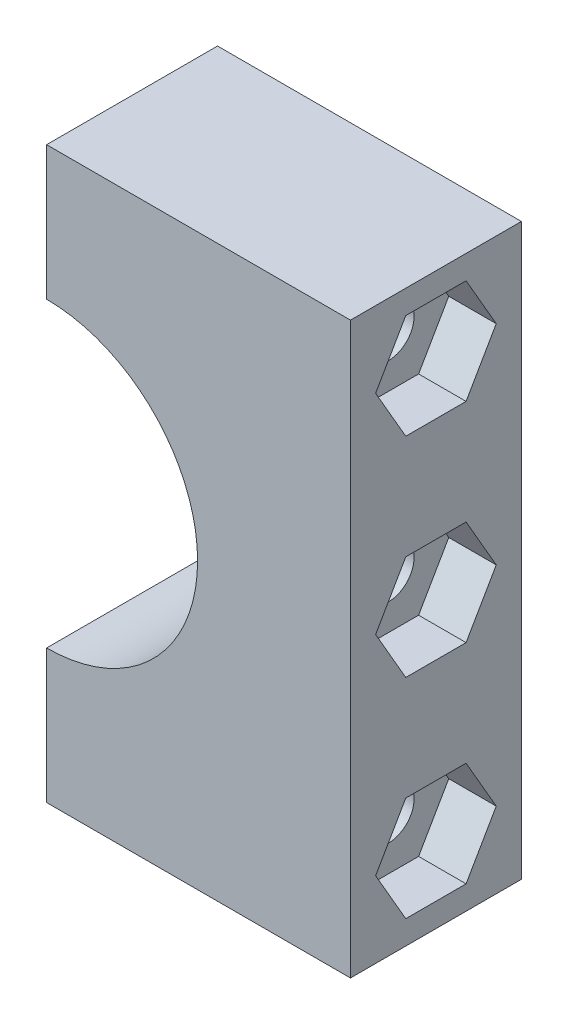
ISO-10303-21;
HEADER;
FILE_DESCRIPTION(('STEP AP214'),'2;1');
FILE_NAME('part.step','',(''),(''),'','','');
FILE_SCHEMA(('AUTOMOTIVE_DESIGN { 1 0 10303 214 1 1 1 1 }'));
ENDSEC;
DATA;
#1=APPLICATION_CONTEXT('core data for automotive mechanical design processes');
#2=APPLICATION_PROTOCOL_DEFINITION('international standard','automotive_design',2000,#1);
#3=PRODUCT_CONTEXT('',#1,'mechanical');
#4=PRODUCT('Part','Part','',(#3));
#5=PRODUCT_RELATED_PRODUCT_CATEGORY('part','',(#4));
#6=PRODUCT_DEFINITION_FORMATION('','',#4);
#7=PRODUCT_DEFINITION_CONTEXT('part definition',#1,'design');
#8=PRODUCT_DEFINITION('design','',#6,#7);
#9=PRODUCT_DEFINITION_SHAPE('','',#8);
#10=(LENGTH_UNIT() NAMED_UNIT(*) SI_UNIT(.MILLI.,.METRE.));
#11=(NAMED_UNIT(*) PLANE_ANGLE_UNIT() SI_UNIT($,.RADIAN.));
#12=(NAMED_UNIT(*) SI_UNIT($,.STERADIAN.) SOLID_ANGLE_UNIT());
#13=UNCERTAINTY_MEASURE_WITH_UNIT(LENGTH_MEASURE(1.E-05),#10,'distance_accuracy_value','');
#14=(GEOMETRIC_REPRESENTATION_CONTEXT(3) GLOBAL_UNCERTAINTY_ASSIGNED_CONTEXT((#13)) GLOBAL_UNIT_ASSIGNED_CONTEXT((#10,
#11,#12)) REPRESENTATION_CONTEXT('',''));
#15=CARTESIAN_POINT('',(0.,0.,0.));
#16=DIRECTION('',(0.,0.,1.));
#17=DIRECTION('',(1.,0.,0.));
#18=AXIS2_PLACEMENT_3D('',#15,#16,#17);
#19=CARTESIAN_POINT('',(-18.,26.,4.));
#20=DIRECTION('',(1.,0.,0.));
#21=DIRECTION('',(0.,0.,-1.));
#22=AXIS2_PLACEMENT_3D('',#19,#20,#21);
#23=CYLINDRICAL_SURFACE('',#22,1.35);
#24=CARTESIAN_POINT('',(16.,26.,4.));
#25=DIRECTION('',(1.,0.,0.));
#26=DIRECTION('',(0.,1.,0.));
#27=AXIS2_PLACEMENT_3D('',#24,#25,#26);
#28=CIRCLE('',#27,1.35);
#29=CARTESIAN_POINT('',(16.,27.35,4.));
#30=VERTEX_POINT('',#29);
#31=EDGE_CURVE('E402',#30,#30,#28,.F.);
#32=ORIENTED_EDGE('',*,*,#31,.T.);
#33=EDGE_LOOP('',(#32));
#34=FACE_BOUND('',#33,.T.);
#35=CARTESIAN_POINT('',(29.5,26.,4.));
#36=DIRECTION('',(1.,0.,0.));
#37=DIRECTION('',(0.,0.,-1.));
#38=AXIS2_PLACEMENT_3D('',#35,#36,#37);
#39=CIRCLE('',#38,1.35);
#40=CARTESIAN_POINT('',(29.5,26.,2.65));
#41=VERTEX_POINT('',#40);
#42=EDGE_CURVE('E49',#41,#41,#39,.F.);
#43=ORIENTED_EDGE('',*,*,#42,.F.);
#44=EDGE_LOOP('',(#43));
#45=FACE_BOUND('',#44,.T.);
#46=ADVANCED_FACE('F45',(#34,#45),#23,.F.);
#47=CARTESIAN_POINT('',(-18.,4.00000000000002,4.));
#48=DIRECTION('',(1.,0.,0.));
#49=DIRECTION('',(0.,0.,-1.));
#50=AXIS2_PLACEMENT_3D('',#47,#48,#49);
#51=CYLINDRICAL_SURFACE('',#50,1.35);
#52=CARTESIAN_POINT('',(16.,4.00000000000002,4.));
#53=DIRECTION('',(1.,0.,0.));
#54=DIRECTION('',(0.,1.,0.));
#55=AXIS2_PLACEMENT_3D('',#52,#53,#54);
#56=CIRCLE('',#55,1.35);
#57=CARTESIAN_POINT('',(16.,5.35000000000001,4.));
#58=VERTEX_POINT('',#57);
#59=EDGE_CURVE('E399',#58,#58,#56,.F.);
#60=ORIENTED_EDGE('',*,*,#59,.T.);
#61=EDGE_LOOP('',(#60));
#62=FACE_BOUND('',#61,.T.);
#63=CARTESIAN_POINT('',(29.5,4.00000000000002,4.));
#64=DIRECTION('',(1.,0.,0.));
#65=DIRECTION('',(0.,0.,-1.));
#66=AXIS2_PLACEMENT_3D('',#63,#64,#65);
#67=CIRCLE('',#66,1.35);
#68=CARTESIAN_POINT('',(29.5,4.00000000000002,2.65));
#69=VERTEX_POINT('',#68);
#70=EDGE_CURVE('E441',#69,#69,#67,.F.);
#71=ORIENTED_EDGE('',*,*,#70,.F.);
#72=EDGE_LOOP('',(#71));
#73=FACE_BOUND('',#72,.T.);
#74=ADVANCED_FACE('F426',(#62,#73),#51,.F.);
#75=CARTESIAN_POINT('',(33.5000000000001,15.,4.));
#76=DIRECTION('',(-1.,0.,0.));
#77=DIRECTION('',(0.,-1.,0.));
#78=AXIS2_PLACEMENT_3D('',#75,#76,#77);
#79=CYLINDRICAL_SURFACE('',#78,1.35);
#80=CARTESIAN_POINT('',(23.8345389143204,13.65,4.));
#81=CARTESIAN_POINT('',(23.8345402896809,13.6500030057231,4.07524121019894));
#82=CARTESIAN_POINT('',(23.8356345656932,13.6563115746264,4.15052298711788));
#83=CARTESIAN_POINT('',(23.8398892360834,13.6813673354661,4.2989727622876));
#84=CARTESIAN_POINT('',(23.8430515138403,13.700125866115,4.37213877016876));
#85=CARTESIAN_POINT('',(23.8510739385248,13.7494964574664,4.514187193638));
#86=CARTESIAN_POINT('',(23.8559326428423,13.7800984490967,4.58307319042451));
#87=CARTESIAN_POINT('',(23.8667987609515,13.8522619655292,4.71472602113277));
#88=CARTESIAN_POINT('',(23.8728060511923,13.8938223117463,4.77749351211398));
#89=CARTESIAN_POINT('',(23.885361122914,13.9871761820743,4.89577666364969));
#90=CARTESIAN_POINT('',(23.8919133496754,14.0390599203112,4.95122066161677));
#91=CARTESIAN_POINT('',(23.9047805676659,14.1513928201779,5.05266025192229));
#92=CARTESIAN_POINT('',(23.9110955446055,14.211842496697,5.09865527588556));
#93=CARTESIAN_POINT('',(23.9228238648795,14.3400566047597,5.18016108323956));
#94=CARTESIAN_POINT('',(23.9282313705954,14.4078640958699,5.21560504278978));
#95=CARTESIAN_POINT('',(23.9374859584125,14.5485777418357,5.27457293519653));
#96=CARTESIAN_POINT('',(23.9413331458003,14.6214835522793,5.29809767236077));
#97=CARTESIAN_POINT('',(23.9470022395307,14.7695835793652,5.33233980018562));
#98=CARTESIAN_POINT('',(23.9488431847372,14.8447492013919,5.34317766132763));
#99=CARTESIAN_POINT('',(23.9503578124045,14.9958530169301,5.35211311098387));
#100=CARTESIAN_POINT('',(23.9500316475345,15.0717911556428,5.35021159696575));
#101=CARTESIAN_POINT('',(23.9472638485025,15.2214603543347,5.3338159998396));
#102=CARTESIAN_POINT('',(23.9448439969209,15.2952060783933,5.31945157576363));
#103=CARTESIAN_POINT('',(23.9381850258259,15.439225037142,5.27874220772727));
#104=CARTESIAN_POINT('',(23.9339458492645,15.5094981628658,5.25239688808358));
#105=CARTESIAN_POINT('',(23.9240875522242,15.6449613589112,5.18834548699411));
#106=CARTESIAN_POINT('',(23.9184619934958,15.7101257886084,5.15058620916011));
#107=CARTESIAN_POINT('',(23.9064555315978,15.8332423873977,5.06481774349962));
#108=CARTESIAN_POINT('',(23.900074565045,15.8911939504488,5.01680769529981));
#109=CARTESIAN_POINT('',(23.887171684043,15.9990061663545,4.91118203418175));
#110=CARTESIAN_POINT('',(23.8806490065354,16.0487557492474,4.85345307994392));
#111=CARTESIAN_POINT('',(23.8682754309721,16.1378807239073,4.73040958274816));
#112=CARTESIAN_POINT('',(23.8624245395802,16.1772560127753,4.66509496455993));
#113=CARTESIAN_POINT('',(23.8520564949911,16.2445379152312,4.52860272617324));
#114=CARTESIAN_POINT('',(23.8475409449085,16.2724307594404,4.45741818896893));
#115=CARTESIAN_POINT('',(23.8403810705725,16.3158317557455,4.31128016065101));
#116=CARTESIAN_POINT('',(23.8377365748738,16.3313410425672,4.23632701553031));
#117=CARTESIAN_POINT('',(23.8346515126372,16.3493774466755,4.0857743150227));
#118=CARTESIAN_POINT('',(23.8341840383679,16.3520630734842,4.0101942830836));
#119=CARTESIAN_POINT('',(23.8354342298211,16.3447986850079,3.85966481014587));
#120=CARTESIAN_POINT('',(23.8371518077838,16.3348491771975,3.78471534394306));
#121=CARTESIAN_POINT('',(23.8425536861105,16.3027322314485,3.63808057748891));
#122=CARTESIAN_POINT('',(23.8462249381763,16.2806458224961,3.56637700641746));
#123=CARTESIAN_POINT('',(23.8551095157805,16.2249671507123,3.42768878668811));
#124=CARTESIAN_POINT('',(23.8603229367133,16.1913741760945,3.36070443026596));
#125=CARTESIAN_POINT('',(23.8717667733464,16.1132631889845,3.23265164678427));
#126=CARTESIAN_POINT('',(23.8780064347367,16.0686438067501,3.17164589554541));
#127=CARTESIAN_POINT('',(23.8907728083339,15.9698853652758,3.05793076103832));
#128=CARTESIAN_POINT('',(23.8972995415048,15.9157456099265,3.0052219849617));
#129=CARTESIAN_POINT('',(23.9099899681497,15.7987801592946,2.90901627540142));
#130=CARTESIAN_POINT('',(23.9161489696111,15.7358668230528,2.86562518116079));
#131=CARTESIAN_POINT('',(23.9273341930818,15.6035514371039,2.79002870010959));
#132=CARTESIAN_POINT('',(23.9323604527983,15.5341496034977,2.7578229409372));
#133=CARTESIAN_POINT('',(23.9406935069907,15.3911385329909,2.7056751395426));
#134=CARTESIAN_POINT('',(23.9440079873105,15.3175497792655,2.68567820493479));
#135=CARTESIAN_POINT('',(23.9485765674427,15.1679975110108,2.65833914657284));
#136=CARTESIAN_POINT('',(23.9498308435288,15.0920342002184,2.65099594014763));
#137=CARTESIAN_POINT('',(23.9501350550667,14.9409097232546,2.64920488309504));
#138=CARTESIAN_POINT('',(23.9492124887618,14.8657504705165,2.65459616910742));
#139=CARTESIAN_POINT('',(23.9453229551411,14.7174245989336,2.67777248880758));
#140=CARTESIAN_POINT('',(23.9423560003523,14.6442579678819,2.69555744655376));
#141=CARTESIAN_POINT('',(23.9347100218578,14.5020591151793,2.74295363413859));
#142=CARTESIAN_POINT('',(23.9300330512435,14.43302205064,2.77255068594201));
#143=CARTESIAN_POINT('',(23.919476977982,14.3008690140801,2.84271281622575));
#144=CARTESIAN_POINT('',(23.9135978148625,14.2377533401481,2.88327844647655));
#145=CARTESIAN_POINT('',(23.9012007258256,14.1184255778674,2.97479414142323));
#146=CARTESIAN_POINT('',(23.8946760444139,14.0623043570977,3.02586178654338));
#147=CARTESIAN_POINT('',(23.8817694558046,13.9593712554011,3.13668546088679));
#148=CARTESIAN_POINT('',(23.8753875824099,13.9125615582707,3.19644352256572));
#149=CARTESIAN_POINT('',(23.8634382543226,13.8292618637177,3.32347577914231));
#150=CARTESIAN_POINT('',(23.8578771537311,13.792850527955,3.3908021599841));
#151=CARTESIAN_POINT('',(23.8482742811776,13.7319106689684,3.53068363735282));
#152=CARTESIAN_POINT('',(23.8442310042188,13.7073703680212,3.6032334690242));
#153=CARTESIAN_POINT('',(23.839010642003,13.6761500626356,3.73004708369539));
#154=CARTESIAN_POINT('',(23.837343157807,13.6663596734231,3.78354641628633));
#155=CARTESIAN_POINT('',(23.8351068079989,13.6532836197094,3.89135679204188));
#156=CARTESIAN_POINT('',(23.8345379211633,13.6499978295473,3.94566781950511));
#157=CARTESIAN_POINT('',(23.8345389143204,13.65,4.));
#158=B_SPLINE_CURVE_WITH_KNOTS('',3,(#80,#81,#82,#83,#84,#85,#86,#87,#88,#89,#90,#91,#92,#93,
#94,#95,#96,#97,#98,#99,#100,#101,#102,#103,#104,#105,#106,#107,#108,#109,#110,#111,#112,#113,
#114,#115,#116,#117,#118,#119,#120,#121,#122,#123,#124,#125,#126,#127,#128,#129,#130,#131,#132,
#133,#134,#135,#136,#137,#138,#139,#140,#141,#142,#143,#144,#145,#146,#147,#148,#149,#150,#151,
#152,#153,#154,#155,#156,#157),.UNSPECIFIED.,.T.,.F.,(4,2,2,2,2,2,2,2,2,2,2,2,2,2,2,2,2,2,2,2,2,
2,2,2,2,2,2,2,2,2,2,2,2,2,2,2,2,2,4),(0.,0.225524927251488,0.451255532066273,0.67679464536077,
0.902309511519384,1.12988926917147,1.35748271220693,1.58648833603836,1.8154785045384,
2.04227614959935,2.26905781731381,2.49350805327407,2.71796532777489,2.94348528321649,
3.16902417456945,3.39740306368013,3.62578421791608,3.85443844728018,4.08307172227672,
4.3088714813722,4.53466217178464,4.75896342533236,4.98327855647241,5.20973806528809,
5.43621413923093,5.66514060473414,5.89405944850343,6.121941315935,6.34980368449991,
6.57480309587852,6.7998011285968,7.02452990492344,7.24926998825619,7.47667851782852,
7.70414031795244,7.93327981135661,8.16219149774792,8.32504770043621,8.48790075690787),.UNSPECIFIED.);
#159=CARTESIAN_POINT('',(23.8345389143204,13.65,4.));
#160=VERTEX_POINT('',#159);
#161=EDGE_CURVE('E217',#160,#160,#158,.T.);
#162=ORIENTED_EDGE('',*,*,#161,.T.);
#163=EDGE_LOOP('',(#162));
#164=FACE_BOUND('',#163,.T.);
#165=CARTESIAN_POINT('',(29.5,15.,4.));
#166=DIRECTION('',(1.,0.,0.));
#167=DIRECTION('',(0.,0.,-1.));
#168=AXIS2_PLACEMENT_3D('',#165,#166,#167);
#169=CIRCLE('',#168,1.35);
#170=CARTESIAN_POINT('',(29.5,15.,2.65));
#171=VERTEX_POINT('',#170);
#172=EDGE_CURVE('E295',#171,#171,#169,.F.);
#173=ORIENTED_EDGE('',*,*,#172,.F.);
#174=EDGE_LOOP('',(#173));
#175=FACE_BOUND('',#174,.T.);
#176=ADVANCED_FACE('F421',(#164,#175),#79,.F.);
#177=CARTESIAN_POINT('',(0.,0.,8.));
#178=DIRECTION('',(0.,1.,0.));
#179=DIRECTION('',(-1.,0.,0.));
#180=AXIS2_PLACEMENT_3D('',#177,#178,#179);
#181=PLANE('',#180);
#182=DIRECTION('',(0.,0.,-1.));
#183=VECTOR('',#182,1.);
#184=CARTESIAN_POINT('',(32.,0.,8.));
#185=LINE('',#184,#183);
#186=CARTESIAN_POINT('',(32.,0.,8.5));
#187=VERTEX_POINT('',#186);
#188=CARTESIAN_POINT('',(32.,0.,-0.5));
#189=VERTEX_POINT('',#188);
#190=EDGE_CURVE('E11',#187,#189,#185,.T.);
#191=ORIENTED_EDGE('',*,*,#190,.F.);
#192=DIRECTION('',(1.,0.,0.));
#193=VECTOR('',#192,1.);
#194=CARTESIAN_POINT('',(16.,0.,8.5));
#195=LINE('',#194,#193);
#196=CARTESIAN_POINT('',(16.,0.,8.5));
#197=VERTEX_POINT('',#196);
#198=EDGE_CURVE('E251',#197,#187,#195,.T.);
#199=ORIENTED_EDGE('',*,*,#198,.F.);
#200=DIRECTION('',(0.,0.,-1.));
#201=VECTOR('',#200,1.);
#202=CARTESIAN_POINT('',(16.,0.,10.));
#203=LINE('',#202,#201);
#204=CARTESIAN_POINT('',(16.,0.,-0.5));
#205=VERTEX_POINT('',#204);
#206=EDGE_CURVE('E397',#197,#205,#203,.T.);
#207=ORIENTED_EDGE('',*,*,#206,.T.);
#208=DIRECTION('',(1.,0.,0.));
#209=VECTOR('',#208,1.);
#210=CARTESIAN_POINT('',(16.,0.,-0.5));
#211=LINE('',#210,#209);
#212=EDGE_CURVE('E230',#205,#189,#211,.T.);
#213=ORIENTED_EDGE('',*,*,#212,.T.);
#214=EDGE_LOOP('',(#191,#199,#207,#213));
#215=FACE_BOUND('',#214,.T.);
#216=ADVANCED_FACE('F47',(#215),#181,.F.);
#217=CARTESIAN_POINT('',(32.,30.,8.));
#218=DIRECTION('',(-1.,0.,0.));
#219=DIRECTION('',(0.,-1.,0.));
#220=AXIS2_PLACEMENT_3D('',#217,#218,#219);
#221=PLANE('',#220);
#222=DIRECTION('',(0.,0.,1.));
#223=VECTOR('',#222,1.);
#224=CARTESIAN_POINT('',(32.,28.75,2.41228675972853));
#225=LINE('',#224,#223);
#226=CARTESIAN_POINT('',(32.,28.75,2.41228675972853));
#227=VERTEX_POINT('',#226);
#228=CARTESIAN_POINT('',(32.,28.75,5.58771324027147));
#229=VERTEX_POINT('',#228);
#230=EDGE_CURVE('E278',#227,#229,#225,.T.);
#231=ORIENTED_EDGE('',*,*,#230,.F.);
#232=DIRECTION('',(0.,0.866025403784439,0.5));
#233=VECTOR('',#232,1.);
#234=CARTESIAN_POINT('',(32.,26.,0.824573519457061));
#235=LINE('',#234,#233);
#236=CARTESIAN_POINT('',(32.,26.,0.824573519457061));
#237=VERTEX_POINT('',#236);
#238=EDGE_CURVE('E62',#237,#227,#235,.T.);
#239=ORIENTED_EDGE('',*,*,#238,.F.);
#240=DIRECTION('',(0.,0.866025403784438,-0.500000000000001));
#241=VECTOR('',#240,1.);
#242=CARTESIAN_POINT('',(32.,23.25,2.41228675972853));
#243=LINE('',#242,#241);
#244=CARTESIAN_POINT('',(32.,23.25,2.41228675972853));
#245=VERTEX_POINT('',#244);
#246=EDGE_CURVE('E261',#245,#237,#243,.T.);
#247=ORIENTED_EDGE('',*,*,#246,.F.);
#248=DIRECTION('',(0.,0.,-1.));
#249=VECTOR('',#248,1.);
#250=CARTESIAN_POINT('',(32.,23.25,5.58771324027147));
#251=LINE('',#250,#249);
#252=CARTESIAN_POINT('',(32.,23.25,5.58771324027147));
#253=VERTEX_POINT('',#252);
#254=EDGE_CURVE('E288',#253,#245,#251,.T.);
#255=ORIENTED_EDGE('',*,*,#254,.F.);
#256=DIRECTION('',(0.,-0.866025403784439,-0.5));
#257=VECTOR('',#256,1.);
#258=CARTESIAN_POINT('',(32.,26.,7.17542648054294));
#259=LINE('',#258,#257);
#260=CARTESIAN_POINT('',(32.,26.,7.17542648054294));
#261=VERTEX_POINT('',#260);
#262=EDGE_CURVE('E285',#261,#253,#259,.T.);
#263=ORIENTED_EDGE('',*,*,#262,.F.);
#264=DIRECTION('',(0.,-0.866025403784438,0.5));
#265=VECTOR('',#264,1.);
#266=CARTESIAN_POINT('',(32.,28.75,5.58771324027147));
#267=LINE('',#266,#265);
#268=EDGE_CURVE('E282',#229,#261,#267,.T.);
#269=ORIENTED_EDGE('',*,*,#268,.F.);
#270=EDGE_LOOP('',(#231,#239,#247,#255,#263,#269));
#271=FACE_BOUND('',#270,.T.);
#272=DIRECTION('',(0.,0.86602540378444,0.499999999999999));
#273=VECTOR('',#272,1.);
#274=CARTESIAN_POINT('',(32.,15.,0.82457351945706));
#275=LINE('',#274,#273);
#276=CARTESIAN_POINT('',(32.,15.,0.824573519457061));
#277=VERTEX_POINT('',#276);
#278=CARTESIAN_POINT('',(32.,17.75,2.41228675972852));
#279=VERTEX_POINT('',#278);
#280=EDGE_CURVE('E326',#277,#279,#275,.T.);
#281=ORIENTED_EDGE('',*,*,#280,.F.);
#282=DIRECTION('',(0.,0.866025403784439,-0.499999999999999));
#283=VECTOR('',#282,1.);
#284=CARTESIAN_POINT('',(32.,12.25,2.41228675972853));
#285=LINE('',#284,#283);
#286=CARTESIAN_POINT('',(32.,12.25,2.41228675972853));
#287=VERTEX_POINT('',#286);
#288=EDGE_CURVE('E70',#287,#277,#285,.T.);
#289=ORIENTED_EDGE('',*,*,#288,.F.);
#290=DIRECTION('',(0.,0.,-1.));
#291=VECTOR('',#290,1.);
#292=CARTESIAN_POINT('',(32.,12.25,5.58771324027144));
#293=LINE('',#292,#291);
#294=CARTESIAN_POINT('',(32.,12.25,5.58771324027144));
#295=VERTEX_POINT('',#294);
#296=EDGE_CURVE('E309',#295,#287,#293,.T.);
#297=ORIENTED_EDGE('',*,*,#296,.F.);
#298=DIRECTION('',(0.,-0.866025403784434,-0.500000000000008));
#299=VECTOR('',#298,1.);
#300=CARTESIAN_POINT('',(32.,14.9999999999999,7.17542648054294));
#301=LINE('',#300,#299);
#302=CARTESIAN_POINT('',(32.,14.9999999999999,7.17542648054294));
#303=VERTEX_POINT('',#302);
#304=EDGE_CURVE('E336',#303,#295,#301,.T.);
#305=ORIENTED_EDGE('',*,*,#304,.F.);
#306=DIRECTION('',(0.,-0.866025403784443,0.499999999999992));
#307=VECTOR('',#306,1.);
#308=CARTESIAN_POINT('',(32.,17.75,5.58771324027149));
#309=LINE('',#308,#307);
#310=CARTESIAN_POINT('',(32.,17.75,5.58771324027149));
#311=VERTEX_POINT('',#310);
#312=EDGE_CURVE('E333',#311,#303,#309,.T.);
#313=ORIENTED_EDGE('',*,*,#312,.F.);
#314=DIRECTION('',(0.,0.,1.));
#315=VECTOR('',#314,1.);
#316=CARTESIAN_POINT('',(32.,17.75,2.41228675972852));
#317=LINE('',#316,#315);
#318=EDGE_CURVE('E330',#279,#311,#317,.T.);
#319=ORIENTED_EDGE('',*,*,#318,.F.);
#320=EDGE_LOOP('',(#281,#289,#297,#305,#313,#319));
#321=FACE_BOUND('',#320,.T.);
#322=DIRECTION('',(0.,0.,1.));
#323=VECTOR('',#322,1.);
#324=CARTESIAN_POINT('',(32.,6.75000000000001,2.41228675972852));
#325=LINE('',#324,#323);
#326=CARTESIAN_POINT('',(32.,6.75000000000001,2.41228675972852));
#327=VERTEX_POINT('',#326);
#328=CARTESIAN_POINT('',(32.,6.75000000000002,5.58771324027147));
#329=VERTEX_POINT('',#328);
#330=EDGE_CURVE('E372',#327,#329,#325,.T.);
#331=ORIENTED_EDGE('',*,*,#330,.F.);
#332=DIRECTION('',(0.,0.866025403784439,0.499999999999999));
#333=VECTOR('',#332,1.);
#334=CARTESIAN_POINT('',(32.,4.00000000000002,0.824573519457058));
#335=LINE('',#334,#333);
#336=CARTESIAN_POINT('',(32.,4.00000000000002,0.824573519457058));
#337=VERTEX_POINT('',#336);
#338=EDGE_CURVE('E256',#337,#327,#335,.T.);
#339=ORIENTED_EDGE('',*,*,#338,.F.);
#340=DIRECTION('',(0.,0.866025403784438,-0.5));
#341=VECTOR('',#340,1.);
#342=CARTESIAN_POINT('',(32.,1.25000000000001,2.41228675972853));
#343=LINE('',#342,#341);
#344=CARTESIAN_POINT('',(32.,1.25000000000001,2.41228675972853));
#345=VERTEX_POINT('',#344);
#346=EDGE_CURVE('E355',#345,#337,#343,.T.);
#347=ORIENTED_EDGE('',*,*,#346,.F.);
#348=DIRECTION('',(0.,0.,-1.));
#349=VECTOR('',#348,1.);
#350=CARTESIAN_POINT('',(32.,1.25000000000002,5.58771324027147));
#351=LINE('',#350,#349);
#352=CARTESIAN_POINT('',(32.,1.25000000000002,5.58771324027147));
#353=VERTEX_POINT('',#352);
#354=EDGE_CURVE('E381',#353,#345,#351,.T.);
#355=ORIENTED_EDGE('',*,*,#354,.F.);
#356=DIRECTION('',(0.,-0.866025403784439,-0.499999999999999));
#357=VECTOR('',#356,1.);
#358=CARTESIAN_POINT('',(32.,4.00000000000002,7.17542648054294));
#359=LINE('',#358,#357);
#360=CARTESIAN_POINT('',(32.,4.00000000000002,7.17542648054294));
#361=VERTEX_POINT('',#360);
#362=EDGE_CURVE('E378',#361,#353,#359,.T.);
#363=ORIENTED_EDGE('',*,*,#362,.F.);
#364=DIRECTION('',(0.,-0.866025403784438,0.500000000000001));
#365=VECTOR('',#364,1.);
#366=CARTESIAN_POINT('',(32.,6.75000000000002,5.58771324027147));
#367=LINE('',#366,#365);
#368=EDGE_CURVE('E375',#329,#361,#367,.T.);
#369=ORIENTED_EDGE('',*,*,#368,.F.);
#370=EDGE_LOOP('',(#331,#339,#347,#355,#363,#369));
#371=FACE_BOUND('',#370,.T.);
#372=ORIENTED_EDGE('',*,*,#190,.T.);
#373=DIRECTION('',(0.,1.,0.));
#374=VECTOR('',#373,1.);
#375=CARTESIAN_POINT('',(32.,30.,-0.5));
#376=LINE('',#375,#374);
#377=CARTESIAN_POINT('',(32.,30.,-0.5));
#378=VERTEX_POINT('',#377);
#379=EDGE_CURVE('E223',#189,#378,#376,.T.);
#380=ORIENTED_EDGE('',*,*,#379,.T.);
#381=DIRECTION('',(0.,0.,-1.));
#382=VECTOR('',#381,1.);
#383=CARTESIAN_POINT('',(32.,30.,8.));
#384=LINE('',#383,#382);
#385=CARTESIAN_POINT('',(32.,30.,8.5));
#386=VERTEX_POINT('',#385);
#387=EDGE_CURVE('E54',#386,#378,#384,.T.);
#388=ORIENTED_EDGE('',*,*,#387,.F.);
#389=DIRECTION('',(0.,1.,0.));
#390=VECTOR('',#389,1.);
#391=CARTESIAN_POINT('',(32.,30.,8.5));
#392=LINE('',#391,#390);
#393=EDGE_CURVE('E254',#187,#386,#392,.T.);
#394=ORIENTED_EDGE('',*,*,#393,.F.);
#395=EDGE_LOOP('',(#372,#380,#388,#394));
#396=FACE_BOUND('',#395,.T.);
#397=ADVANCED_FACE('F229',(#271,#321,#371,#396),#221,.F.);
#398=CARTESIAN_POINT('',(0.,30.,8.));
#399=DIRECTION('',(0.,-1.,0.));
#400=DIRECTION('',(0.,0.,-1.));
#401=AXIS2_PLACEMENT_3D('',#398,#399,#400);
#402=PLANE('',#401);
#403=ORIENTED_EDGE('',*,*,#387,.T.);
#404=DIRECTION('',(-1.,0.,0.));
#405=VECTOR('',#404,1.);
#406=CARTESIAN_POINT('',(32.,30.,-0.5));
#407=LINE('',#406,#405);
#408=CARTESIAN_POINT('',(16.,30.,-0.5));
#409=VERTEX_POINT('',#408);
#410=EDGE_CURVE('E209',#378,#409,#407,.T.);
#411=ORIENTED_EDGE('',*,*,#410,.T.);
#412=DIRECTION('',(0.,0.,-1.));
#413=VECTOR('',#412,1.);
#414=CARTESIAN_POINT('',(16.,30.,10.));
#415=LINE('',#414,#413);
#416=CARTESIAN_POINT('',(16.,30.,8.5));
#417=VERTEX_POINT('',#416);
#418=EDGE_CURVE('E400',#417,#409,#415,.T.);
#419=ORIENTED_EDGE('',*,*,#418,.F.);
#420=DIRECTION('',(-1.,0.,0.));
#421=VECTOR('',#420,1.);
#422=CARTESIAN_POINT('',(32.,30.,8.5));
#423=LINE('',#422,#421);
#424=EDGE_CURVE('E212',#386,#417,#423,.T.);
#425=ORIENTED_EDGE('',*,*,#424,.F.);
#426=EDGE_LOOP('',(#403,#411,#419,#425));
#427=FACE_BOUND('',#426,.T.);
#428=ADVANCED_FACE('F208',(#427),#402,.F.);
#429=CARTESIAN_POINT('',(16.,15.,8.));
#430=DIRECTION('',(0.,0.,-1.));
#431=DIRECTION('',(-1.,0.,0.));
#432=AXIS2_PLACEMENT_3D('',#429,#430,#431);
#433=CYLINDRICAL_SURFACE('',#432,7.95);
#434=DIRECTION('',(0.,0.,-1.));
#435=VECTOR('',#434,1.);
#436=CARTESIAN_POINT('',(16.,7.05,8.));
#437=LINE('',#436,#435);
#438=CARTESIAN_POINT('',(16.,7.05,8.5));
#439=VERTEX_POINT('',#438);
#440=CARTESIAN_POINT('',(16.,7.05,-0.5));
#441=VERTEX_POINT('',#440);
#442=EDGE_CURVE('E407',#439,#441,#437,.T.);
#443=ORIENTED_EDGE('',*,*,#442,.F.);
#444=CARTESIAN_POINT('',(16.,15.,8.5));
#445=DIRECTION('',(0.,0.,-1.));
#446=DIRECTION('',(1.,0.,0.));
#447=AXIS2_PLACEMENT_3D('',#444,#445,#446);
#448=CIRCLE('',#447,7.95);
#449=CARTESIAN_POINT('',(16.,22.95,8.5));
#450=VERTEX_POINT('',#449);
#451=EDGE_CURVE('E245',#450,#439,#448,.T.);
#452=ORIENTED_EDGE('',*,*,#451,.F.);
#453=DIRECTION('',(0.,0.,-1.));
#454=VECTOR('',#453,1.);
#455=CARTESIAN_POINT('',(16.,22.95,8.));
#456=LINE('',#455,#454);
#457=CARTESIAN_POINT('',(16.,22.95,-0.5));
#458=VERTEX_POINT('',#457);
#459=EDGE_CURVE('E405',#458,#450,#456,.F.);
#460=ORIENTED_EDGE('',*,*,#459,.F.);
#461=CARTESIAN_POINT('',(16.,15.,-0.5));
#462=DIRECTION('',(0.,0.,-1.));
#463=DIRECTION('',(1.,0.,0.));
#464=AXIS2_PLACEMENT_3D('',#461,#462,#463);
#465=CIRCLE('',#464,7.95);
#466=EDGE_CURVE('E237',#458,#441,#465,.T.);
#467=ORIENTED_EDGE('',*,*,#466,.T.);
#468=EDGE_LOOP('',(#443,#452,#460,#467));
#469=FACE_BOUND('',#468,.T.);
#470=ORIENTED_EDGE('',*,*,#161,.F.);
#471=EDGE_LOOP('',(#470));
#472=FACE_BOUND('',#471,.T.);
#473=ADVANCED_FACE('F417',(#469,#472),#433,.F.);
#474=CARTESIAN_POINT('',(16.,30.,10.));
#475=DIRECTION('',(1.,0.,0.));
#476=DIRECTION('',(0.,1.,0.));
#477=AXIS2_PLACEMENT_3D('',#474,#475,#476);
#478=PLANE('',#477);
#479=ORIENTED_EDGE('',*,*,#206,.F.);
#480=DIRECTION('',(0.,-1.,0.));
#481=VECTOR('',#480,1.);
#482=CARTESIAN_POINT('',(16.,7.05,8.5));
#483=LINE('',#482,#481);
#484=EDGE_CURVE('E248',#439,#197,#483,.T.);
#485=ORIENTED_EDGE('',*,*,#484,.F.);
#486=ORIENTED_EDGE('',*,*,#442,.T.);
#487=DIRECTION('',(0.,-1.,0.));
#488=VECTOR('',#487,1.);
#489=CARTESIAN_POINT('',(16.,7.05,-0.5));
#490=LINE('',#489,#488);
#491=EDGE_CURVE('E232',#441,#205,#490,.T.);
#492=ORIENTED_EDGE('',*,*,#491,.T.);
#493=EDGE_LOOP('',(#479,#485,#486,#492));
#494=FACE_BOUND('',#493,.T.);
#495=ORIENTED_EDGE('',*,*,#59,.F.);
#496=EDGE_LOOP('',(#495));
#497=FACE_BOUND('',#496,.T.);
#498=ADVANCED_FACE('F428',(#494,#497),#478,.F.);
#499=ORIENTED_EDGE('',*,*,#459,.T.);
#500=DIRECTION('',(0.,-1.,0.));
#501=VECTOR('',#500,1.);
#502=CARTESIAN_POINT('',(16.,30.,8.5));
#503=LINE('',#502,#501);
#504=EDGE_CURVE('E242',#417,#450,#503,.T.);
#505=ORIENTED_EDGE('',*,*,#504,.F.);
#506=ORIENTED_EDGE('',*,*,#418,.T.);
#507=DIRECTION('',(0.,-1.,0.));
#508=VECTOR('',#507,1.);
#509=CARTESIAN_POINT('',(16.,30.,-0.5));
#510=LINE('',#509,#508);
#511=EDGE_CURVE('E227',#409,#458,#510,.T.);
#512=ORIENTED_EDGE('',*,*,#511,.T.);
#513=EDGE_LOOP('',(#499,#505,#506,#512));
#514=FACE_BOUND('',#513,.T.);
#515=ORIENTED_EDGE('',*,*,#31,.F.);
#516=EDGE_LOOP('',(#515));
#517=FACE_BOUND('',#516,.T.);
#518=ADVANCED_FACE('F452',(#514,#517),#478,.F.);
#519=CARTESIAN_POINT('',(29.5,0.,0.));
#520=DIRECTION('',(1.,0.,0.));
#521=DIRECTION('',(0.,0.,-1.));
#522=AXIS2_PLACEMENT_3D('',#519,#520,#521);
#523=PLANE('',#522);
#524=DIRECTION('',(0.,0.866025403784439,-0.499999999999999));
#525=VECTOR('',#524,1.);
#526=CARTESIAN_POINT('',(29.5,12.25,2.41228675972853));
#527=LINE('',#526,#525);
#528=CARTESIAN_POINT('',(29.5,12.25,2.41228675972853));
#529=VERTEX_POINT('',#528);
#530=CARTESIAN_POINT('',(29.5,15.,0.82457351945706));
#531=VERTEX_POINT('',#530);
#532=EDGE_CURVE('E305',#529,#531,#527,.T.);
#533=ORIENTED_EDGE('',*,*,#532,.T.);
#534=DIRECTION('',(0.,0.86602540378444,0.499999999999999));
#535=VECTOR('',#534,1.);
#536=CARTESIAN_POINT('',(29.5,15.,0.82457351945706));
#537=LINE('',#536,#535);
#538=CARTESIAN_POINT('',(29.5,17.75,2.41228675972852));
#539=VERTEX_POINT('',#538);
#540=EDGE_CURVE('E308',#531,#539,#537,.T.);
#541=ORIENTED_EDGE('',*,*,#540,.T.);
#542=DIRECTION('',(0.,0.,1.));
#543=VECTOR('',#542,1.);
#544=CARTESIAN_POINT('',(29.5,17.75,2.41228675972852));
#545=LINE('',#544,#543);
#546=CARTESIAN_POINT('',(29.5,17.75,5.58771324027149));
#547=VERTEX_POINT('',#546);
#548=EDGE_CURVE('E312',#539,#547,#545,.T.);
#549=ORIENTED_EDGE('',*,*,#548,.T.);
#550=DIRECTION('',(0.,-0.866025403784443,0.499999999999992));
#551=VECTOR('',#550,1.);
#552=CARTESIAN_POINT('',(29.5,17.75,5.58771324027149));
#553=LINE('',#552,#551);
#554=CARTESIAN_POINT('',(29.5,14.9999999999999,7.17542648054294));
#555=VERTEX_POINT('',#554);
#556=EDGE_CURVE('E315',#547,#555,#553,.T.);
#557=ORIENTED_EDGE('',*,*,#556,.T.);
#558=DIRECTION('',(0.,-0.866025403784434,-0.500000000000008));
#559=VECTOR('',#558,1.);
#560=CARTESIAN_POINT('',(29.5,14.9999999999999,7.17542648054294));
#561=LINE('',#560,#559);
#562=CARTESIAN_POINT('',(29.5,12.25,5.58771324027144));
#563=VERTEX_POINT('',#562);
#564=EDGE_CURVE('E318',#555,#563,#561,.T.);
#565=ORIENTED_EDGE('',*,*,#564,.T.);
#566=DIRECTION('',(0.,0.,-1.));
#567=VECTOR('',#566,1.);
#568=CARTESIAN_POINT('',(29.5,12.25,5.58771324027144));
#569=LINE('',#568,#567);
#570=EDGE_CURVE('E321',#563,#529,#569,.T.);
#571=ORIENTED_EDGE('',*,*,#570,.T.);
#572=EDGE_LOOP('',(#533,#541,#549,#557,#565,#571));
#573=FACE_BOUND('',#572,.T.);
#574=ORIENTED_EDGE('',*,*,#172,.T.);
#575=EDGE_LOOP('',(#574));
#576=FACE_BOUND('',#575,.T.);
#577=ADVANCED_FACE('F448',(#573,#576),#523,.T.);
#578=CARTESIAN_POINT('',(29.5,12.25,2.41228675972853));
#579=DIRECTION('',(0.,-0.499999999999999,-0.866025403784439));
#580=DIRECTION('',(0.,0.866025403784439,-0.499999999999999));
#581=AXIS2_PLACEMENT_3D('',#578,#579,#580);
#582=PLANE('',#581);
#583=ORIENTED_EDGE('',*,*,#288,.T.);
#584=DIRECTION('',(1.,0.,0.));
#585=VECTOR('',#584,1.);
#586=CARTESIAN_POINT('',(29.5,15.,0.82457351945706));
#587=LINE('',#586,#585);
#588=EDGE_CURVE('E324',#531,#277,#587,.T.);
#589=ORIENTED_EDGE('',*,*,#588,.F.);
#590=ORIENTED_EDGE('',*,*,#532,.F.);
#591=DIRECTION('',(1.,0.,0.));
#592=VECTOR('',#591,1.);
#593=CARTESIAN_POINT('',(29.5,12.25,2.41228675972853));
#594=LINE('',#593,#592);
#595=EDGE_CURVE('E279',#529,#287,#594,.T.);
#596=ORIENTED_EDGE('',*,*,#595,.T.);
#597=EDGE_LOOP('',(#583,#589,#590,#596));
#598=FACE_BOUND('',#597,.T.);
#599=ADVANCED_FACE('F451',(#598),#582,.F.);
#600=CARTESIAN_POINT('',(29.5,12.25,5.58771324027144));
#601=DIRECTION('',(0.,-1.,0.));
#602=DIRECTION('',(0.,0.,-1.));
#603=AXIS2_PLACEMENT_3D('',#600,#601,#602);
#604=PLANE('',#603);
#605=ORIENTED_EDGE('',*,*,#296,.T.);
#606=ORIENTED_EDGE('',*,*,#595,.F.);
#607=ORIENTED_EDGE('',*,*,#570,.F.);
#608=DIRECTION('',(1.,0.,0.));
#609=VECTOR('',#608,1.);
#610=CARTESIAN_POINT('',(29.5,12.25,5.58771324027144));
#611=LINE('',#610,#609);
#612=EDGE_CURVE('E342',#563,#295,#611,.T.);
#613=ORIENTED_EDGE('',*,*,#612,.T.);
#614=EDGE_LOOP('',(#605,#606,#607,#613));
#615=FACE_BOUND('',#614,.T.);
#616=ADVANCED_FACE('F458',(#615),#604,.F.);
#617=CARTESIAN_POINT('',(29.5,14.9999999999999,7.17542648054294));
#618=DIRECTION('',(0.,-0.500000000000008,0.866025403784434));
#619=DIRECTION('',(0.,-0.866025403784434,-0.500000000000008));
#620=AXIS2_PLACEMENT_3D('',#617,#618,#619);
#621=PLANE('',#620);
#622=ORIENTED_EDGE('',*,*,#304,.T.);
#623=ORIENTED_EDGE('',*,*,#612,.F.);
#624=ORIENTED_EDGE('',*,*,#564,.F.);
#625=DIRECTION('',(1.,0.,0.));
#626=VECTOR('',#625,1.);
#627=CARTESIAN_POINT('',(29.5,14.9999999999999,7.17542648054294));
#628=LINE('',#627,#626);
#629=EDGE_CURVE('E344',#555,#303,#628,.T.);
#630=ORIENTED_EDGE('',*,*,#629,.T.);
#631=EDGE_LOOP('',(#622,#623,#624,#630));
#632=FACE_BOUND('',#631,.T.);
#633=ADVANCED_FACE('F468',(#632),#621,.F.);
#634=CARTESIAN_POINT('',(29.5,17.75,5.58771324027149));
#635=DIRECTION('',(0.,0.499999999999992,0.866025403784443));
#636=DIRECTION('',(0.,-0.866025403784443,0.499999999999992));
#637=AXIS2_PLACEMENT_3D('',#634,#635,#636);
#638=PLANE('',#637);
#639=ORIENTED_EDGE('',*,*,#312,.T.);
#640=ORIENTED_EDGE('',*,*,#629,.F.);
#641=ORIENTED_EDGE('',*,*,#556,.F.);
#642=DIRECTION('',(1.,0.,0.));
#643=VECTOR('',#642,1.);
#644=CARTESIAN_POINT('',(29.5,17.75,5.58771324027149));
#645=LINE('',#644,#643);
#646=EDGE_CURVE('E346',#547,#311,#645,.T.);
#647=ORIENTED_EDGE('',*,*,#646,.T.);
#648=EDGE_LOOP('',(#639,#640,#641,#647));
#649=FACE_BOUND('',#648,.T.);
#650=ADVANCED_FACE('F472',(#649),#638,.F.);
#651=CARTESIAN_POINT('',(29.5,17.75,2.41228675972852));
#652=DIRECTION('',(0.,1.,0.));
#653=DIRECTION('',(0.,0.,1.));
#654=AXIS2_PLACEMENT_3D('',#651,#652,#653);
#655=PLANE('',#654);
#656=ORIENTED_EDGE('',*,*,#318,.T.);
#657=ORIENTED_EDGE('',*,*,#646,.F.);
#658=ORIENTED_EDGE('',*,*,#548,.F.);
#659=DIRECTION('',(1.,0.,0.));
#660=VECTOR('',#659,1.);
#661=CARTESIAN_POINT('',(29.5,17.75,2.41228675972852));
#662=LINE('',#661,#660);
#663=EDGE_CURVE('E348',#539,#279,#662,.T.);
#664=ORIENTED_EDGE('',*,*,#663,.T.);
#665=EDGE_LOOP('',(#656,#657,#658,#664));
#666=FACE_BOUND('',#665,.T.);
#667=ADVANCED_FACE('F476',(#666),#655,.F.);
#668=CARTESIAN_POINT('',(29.5,15.,0.82457351945706));
#669=DIRECTION('',(0.,0.499999999999998,-0.86602540378444));
#670=DIRECTION('',(0.,0.86602540378444,0.499999999999998));
#671=AXIS2_PLACEMENT_3D('',#668,#669,#670);
#672=PLANE('',#671);
#673=ORIENTED_EDGE('',*,*,#280,.T.);
#674=ORIENTED_EDGE('',*,*,#663,.F.);
#675=ORIENTED_EDGE('',*,*,#540,.F.);
#676=ORIENTED_EDGE('',*,*,#588,.T.);
#677=EDGE_LOOP('',(#673,#674,#675,#676));
#678=FACE_BOUND('',#677,.T.);
#679=ADVANCED_FACE('F480',(#678),#672,.F.);
#680=CARTESIAN_POINT('',(29.5,0.,0.));
#681=DIRECTION('',(1.,0.,0.));
#682=DIRECTION('',(0.,0.,-1.));
#683=AXIS2_PLACEMENT_3D('',#680,#681,#682);
#684=PLANE('',#683);
#685=DIRECTION('',(0.,0.866025403784439,0.499999999999999));
#686=VECTOR('',#685,1.);
#687=CARTESIAN_POINT('',(29.5,4.00000000000002,0.824573519457058));
#688=LINE('',#687,#686);
#689=CARTESIAN_POINT('',(29.5,4.00000000000002,0.824573519457058));
#690=VERTEX_POINT('',#689);
#691=CARTESIAN_POINT('',(29.5,6.75000000000001,2.41228675972852));
#692=VERTEX_POINT('',#691);
#693=EDGE_CURVE('E351',#690,#692,#688,.T.);
#694=ORIENTED_EDGE('',*,*,#693,.T.);
#695=DIRECTION('',(0.,0.,1.));
#696=VECTOR('',#695,1.);
#697=CARTESIAN_POINT('',(29.5,6.75000000000001,2.41228675972852));
#698=LINE('',#697,#696);
#699=CARTESIAN_POINT('',(29.5,6.75000000000002,5.58771324027147));
#700=VERTEX_POINT('',#699);
#701=EDGE_CURVE('E354',#692,#700,#698,.T.);
#702=ORIENTED_EDGE('',*,*,#701,.T.);
#703=DIRECTION('',(0.,-0.866025403784438,0.500000000000001));
#704=VECTOR('',#703,1.);
#705=CARTESIAN_POINT('',(29.5,6.75000000000002,5.58771324027147));
#706=LINE('',#705,#704);
#707=CARTESIAN_POINT('',(29.5,4.00000000000002,7.17542648054294));
#708=VERTEX_POINT('',#707);
#709=EDGE_CURVE('E358',#700,#708,#706,.T.);
#710=ORIENTED_EDGE('',*,*,#709,.T.);
#711=DIRECTION('',(0.,-0.866025403784439,-0.499999999999999));
#712=VECTOR('',#711,1.);
#713=CARTESIAN_POINT('',(29.5,4.00000000000002,7.17542648054294));
#714=LINE('',#713,#712);
#715=CARTESIAN_POINT('',(29.5,1.25000000000002,5.58771324027147));
#716=VERTEX_POINT('',#715);
#717=EDGE_CURVE('E361',#708,#716,#714,.T.);
#718=ORIENTED_EDGE('',*,*,#717,.T.);
#719=DIRECTION('',(0.,0.,-1.));
#720=VECTOR('',#719,1.);
#721=CARTESIAN_POINT('',(29.5,1.25000000000002,5.58771324027147));
#722=LINE('',#721,#720);
#723=CARTESIAN_POINT('',(29.5,1.25000000000001,2.41228675972853));
#724=VERTEX_POINT('',#723);
#725=EDGE_CURVE('E364',#716,#724,#722,.T.);
#726=ORIENTED_EDGE('',*,*,#725,.T.);
#727=DIRECTION('',(0.,0.866025403784438,-0.5));
#728=VECTOR('',#727,1.);
#729=CARTESIAN_POINT('',(29.5,1.25000000000001,2.41228675972853));
#730=LINE('',#729,#728);
#731=EDGE_CURVE('E367',#724,#690,#730,.T.);
#732=ORIENTED_EDGE('',*,*,#731,.T.);
#733=EDGE_LOOP('',(#694,#702,#710,#718,#726,#732));
#734=FACE_BOUND('',#733,.T.);
#735=ORIENTED_EDGE('',*,*,#70,.T.);
#736=EDGE_LOOP('',(#735));
#737=FACE_BOUND('',#736,.T.);
#738=ADVANCED_FACE('F483',(#734,#737),#684,.T.);
#739=CARTESIAN_POINT('',(29.5,4.00000000000002,0.824573519457058));
#740=DIRECTION('',(0.,0.499999999999999,-0.866025403784439));
#741=DIRECTION('',(0.,0.866025403784439,0.499999999999999));
#742=AXIS2_PLACEMENT_3D('',#739,#740,#741);
#743=PLANE('',#742);
#744=ORIENTED_EDGE('',*,*,#338,.T.);
#745=DIRECTION('',(1.,0.,0.));
#746=VECTOR('',#745,1.);
#747=CARTESIAN_POINT('',(29.5,6.75000000000001,2.41228675972852));
#748=LINE('',#747,#746);
#749=EDGE_CURVE('E370',#692,#327,#748,.T.);
#750=ORIENTED_EDGE('',*,*,#749,.F.);
#751=ORIENTED_EDGE('',*,*,#693,.F.);
#752=DIRECTION('',(1.,0.,0.));
#753=VECTOR('',#752,1.);
#754=CARTESIAN_POINT('',(29.5,4.00000000000002,0.824573519457058));
#755=LINE('',#754,#753);
#756=EDGE_CURVE('E327',#690,#337,#755,.T.);
#757=ORIENTED_EDGE('',*,*,#756,.T.);
#758=EDGE_LOOP('',(#744,#750,#751,#757));
#759=FACE_BOUND('',#758,.T.);
#760=ADVANCED_FACE('F488',(#759),#743,.F.);
#761=CARTESIAN_POINT('',(29.5,1.25000000000001,2.41228675972853));
#762=DIRECTION('',(0.,-0.5,-0.866025403784438));
#763=DIRECTION('',(0.,0.866025403784438,-0.5));
#764=AXIS2_PLACEMENT_3D('',#761,#762,#763);
#765=PLANE('',#764);
#766=ORIENTED_EDGE('',*,*,#346,.T.);
#767=ORIENTED_EDGE('',*,*,#756,.F.);
#768=ORIENTED_EDGE('',*,*,#731,.F.);
#769=DIRECTION('',(1.,0.,0.));
#770=VECTOR('',#769,1.);
#771=CARTESIAN_POINT('',(29.5,1.25000000000001,2.41228675972853));
#772=LINE('',#771,#770);
#773=EDGE_CURVE('E387',#724,#345,#772,.T.);
#774=ORIENTED_EDGE('',*,*,#773,.T.);
#775=EDGE_LOOP('',(#766,#767,#768,#774));
#776=FACE_BOUND('',#775,.T.);
#777=ADVANCED_FACE('F490',(#776),#765,.F.);
#778=CARTESIAN_POINT('',(29.5,1.25000000000002,5.58771324027147));
#779=DIRECTION('',(0.,-1.,0.));
#780=DIRECTION('',(0.,0.,-1.));
#781=AXIS2_PLACEMENT_3D('',#778,#779,#780);
#782=PLANE('',#781);
#783=ORIENTED_EDGE('',*,*,#354,.T.);
#784=ORIENTED_EDGE('',*,*,#773,.F.);
#785=ORIENTED_EDGE('',*,*,#725,.F.);
#786=DIRECTION('',(1.,0.,0.));
#787=VECTOR('',#786,1.);
#788=CARTESIAN_POINT('',(29.5,1.25000000000002,5.58771324027147));
#789=LINE('',#788,#787);
#790=EDGE_CURVE('E389',#716,#353,#789,.T.);
#791=ORIENTED_EDGE('',*,*,#790,.T.);
#792=EDGE_LOOP('',(#783,#784,#785,#791));
#793=FACE_BOUND('',#792,.T.);
#794=ADVANCED_FACE('F493',(#793),#782,.F.);
#795=CARTESIAN_POINT('',(29.5,4.00000000000002,7.17542648054294));
#796=DIRECTION('',(0.,-0.499999999999999,0.866025403784439));
#797=DIRECTION('',(0.,-0.866025403784439,-0.499999999999999));
#798=AXIS2_PLACEMENT_3D('',#795,#796,#797);
#799=PLANE('',#798);
#800=ORIENTED_EDGE('',*,*,#362,.T.);
#801=ORIENTED_EDGE('',*,*,#790,.F.);
#802=ORIENTED_EDGE('',*,*,#717,.F.);
#803=DIRECTION('',(1.,0.,0.));
#804=VECTOR('',#803,1.);
#805=CARTESIAN_POINT('',(29.5,4.00000000000002,7.17542648054294));
#806=LINE('',#805,#804);
#807=EDGE_CURVE('E391',#708,#361,#806,.T.);
#808=ORIENTED_EDGE('',*,*,#807,.T.);
#809=EDGE_LOOP('',(#800,#801,#802,#808));
#810=FACE_BOUND('',#809,.T.);
#811=ADVANCED_FACE('F497',(#810),#799,.F.);
#812=CARTESIAN_POINT('',(29.5,6.75000000000002,5.58771324027147));
#813=DIRECTION('',(0.,0.500000000000001,0.866025403784438));
#814=DIRECTION('',(0.,-0.866025403784438,0.500000000000001));
#815=AXIS2_PLACEMENT_3D('',#812,#813,#814);
#816=PLANE('',#815);
#817=ORIENTED_EDGE('',*,*,#368,.T.);
#818=ORIENTED_EDGE('',*,*,#807,.F.);
#819=ORIENTED_EDGE('',*,*,#709,.F.);
#820=DIRECTION('',(1.,0.,0.));
#821=VECTOR('',#820,1.);
#822=CARTESIAN_POINT('',(29.5,6.75000000000002,5.58771324027147));
#823=LINE('',#822,#821);
#824=EDGE_CURVE('E393',#700,#329,#823,.T.);
#825=ORIENTED_EDGE('',*,*,#824,.T.);
#826=EDGE_LOOP('',(#817,#818,#819,#825));
#827=FACE_BOUND('',#826,.T.);
#828=ADVANCED_FACE('F501',(#827),#816,.F.);
#829=CARTESIAN_POINT('',(29.5,6.75000000000001,2.41228675972852));
#830=DIRECTION('',(0.,1.,0.));
#831=DIRECTION('',(0.,0.,1.));
#832=AXIS2_PLACEMENT_3D('',#829,#830,#831);
#833=PLANE('',#832);
#834=ORIENTED_EDGE('',*,*,#330,.T.);
#835=ORIENTED_EDGE('',*,*,#824,.F.);
#836=ORIENTED_EDGE('',*,*,#701,.F.);
#837=ORIENTED_EDGE('',*,*,#749,.T.);
#838=EDGE_LOOP('',(#834,#835,#836,#837));
#839=FACE_BOUND('',#838,.T.);
#840=ADVANCED_FACE('F505',(#839),#833,.F.);
#841=CARTESIAN_POINT('',(29.5,0.,0.));
#842=DIRECTION('',(1.,0.,0.));
#843=DIRECTION('',(0.,0.,-1.));
#844=AXIS2_PLACEMENT_3D('',#841,#842,#843);
#845=PLANE('',#844);
#846=DIRECTION('',(0.,0.866025403784439,0.5));
#847=VECTOR('',#846,1.);
#848=CARTESIAN_POINT('',(29.5,26.,0.824573519457061));
#849=LINE('',#848,#847);
#850=CARTESIAN_POINT('',(29.5,26.,0.824573519457061));
#851=VERTEX_POINT('',#850);
#852=CARTESIAN_POINT('',(29.5,28.75,2.41228675972853));
#853=VERTEX_POINT('',#852);
#854=EDGE_CURVE('E257',#851,#853,#849,.T.);
#855=ORIENTED_EDGE('',*,*,#854,.T.);
#856=DIRECTION('',(0.,0.,1.));
#857=VECTOR('',#856,1.);
#858=CARTESIAN_POINT('',(29.5,28.75,2.41228675972853));
#859=LINE('',#858,#857);
#860=CARTESIAN_POINT('',(29.5,28.75,5.58771324027147));
#861=VERTEX_POINT('',#860);
#862=EDGE_CURVE('E260',#853,#861,#859,.T.);
#863=ORIENTED_EDGE('',*,*,#862,.T.);
#864=DIRECTION('',(0.,-0.866025403784438,0.5));
#865=VECTOR('',#864,1.);
#866=CARTESIAN_POINT('',(29.5,28.75,5.58771324027147));
#867=LINE('',#866,#865);
#868=CARTESIAN_POINT('',(29.5,26.,7.17542648054294));
#869=VERTEX_POINT('',#868);
#870=EDGE_CURVE('E264',#861,#869,#867,.T.);
#871=ORIENTED_EDGE('',*,*,#870,.T.);
#872=DIRECTION('',(0.,-0.866025403784439,-0.5));
#873=VECTOR('',#872,1.);
#874=CARTESIAN_POINT('',(29.5,26.,7.17542648054294));
#875=LINE('',#874,#873);
#876=CARTESIAN_POINT('',(29.5,23.25,5.58771324027147));
#877=VERTEX_POINT('',#876);
#878=EDGE_CURVE('E267',#869,#877,#875,.T.);
#879=ORIENTED_EDGE('',*,*,#878,.T.);
#880=DIRECTION('',(0.,0.,-1.));
#881=VECTOR('',#880,1.);
#882=CARTESIAN_POINT('',(29.5,23.25,5.58771324027147));
#883=LINE('',#882,#881);
#884=CARTESIAN_POINT('',(29.5,23.25,2.41228675972853));
#885=VERTEX_POINT('',#884);
#886=EDGE_CURVE('E270',#877,#885,#883,.T.);
#887=ORIENTED_EDGE('',*,*,#886,.T.);
#888=DIRECTION('',(0.,0.866025403784438,-0.500000000000001));
#889=VECTOR('',#888,1.);
#890=CARTESIAN_POINT('',(29.5,23.25,2.41228675972853));
#891=LINE('',#890,#889);
#892=EDGE_CURVE('E273',#885,#851,#891,.T.);
#893=ORIENTED_EDGE('',*,*,#892,.T.);
#894=EDGE_LOOP('',(#855,#863,#871,#879,#887,#893));
#895=FACE_BOUND('',#894,.T.);
#896=ORIENTED_EDGE('',*,*,#42,.T.);
#897=EDGE_LOOP('',(#896));
#898=FACE_BOUND('',#897,.T.);
#899=ADVANCED_FACE('F508',(#895,#898),#845,.T.);
#900=CARTESIAN_POINT('',(29.5,26.,0.824573519457061));
#901=DIRECTION('',(0.,0.5,-0.866025403784439));
#902=DIRECTION('',(0.,0.866025403784439,0.5));
#903=AXIS2_PLACEMENT_3D('',#900,#901,#902);
#904=PLANE('',#903);
#905=ORIENTED_EDGE('',*,*,#238,.T.);
#906=DIRECTION('',(1.,0.,0.));
#907=VECTOR('',#906,1.);
#908=CARTESIAN_POINT('',(29.5,28.75,2.41228675972853));
#909=LINE('',#908,#907);
#910=EDGE_CURVE('E276',#853,#227,#909,.T.);
#911=ORIENTED_EDGE('',*,*,#910,.F.);
#912=ORIENTED_EDGE('',*,*,#854,.F.);
#913=DIRECTION('',(1.,0.,0.));
#914=VECTOR('',#913,1.);
#915=CARTESIAN_POINT('',(29.5,26.,0.824573519457061));
#916=LINE('',#915,#914);
#917=EDGE_CURVE('E293',#851,#237,#916,.T.);
#918=ORIENTED_EDGE('',*,*,#917,.T.);
#919=EDGE_LOOP('',(#905,#911,#912,#918));
#920=FACE_BOUND('',#919,.T.);
#921=ADVANCED_FACE('F464',(#920),#904,.F.);
#922=CARTESIAN_POINT('',(29.5,23.25,2.41228675972853));
#923=DIRECTION('',(0.,-0.500000000000001,-0.866025403784438));
#924=DIRECTION('',(0.,0.866025403784438,-0.500000000000001));
#925=AXIS2_PLACEMENT_3D('',#922,#923,#924);
#926=PLANE('',#925);
#927=ORIENTED_EDGE('',*,*,#246,.T.);
#928=ORIENTED_EDGE('',*,*,#917,.F.);
#929=ORIENTED_EDGE('',*,*,#892,.F.);
#930=DIRECTION('',(1.,0.,0.));
#931=VECTOR('',#930,1.);
#932=CARTESIAN_POINT('',(29.5,23.25,2.41228675972853));
#933=LINE('',#932,#931);
#934=EDGE_CURVE('E296',#885,#245,#933,.T.);
#935=ORIENTED_EDGE('',*,*,#934,.T.);
#936=EDGE_LOOP('',(#927,#928,#929,#935));
#937=FACE_BOUND('',#936,.T.);
#938=ADVANCED_FACE('F559',(#937),#926,.F.);
#939=CARTESIAN_POINT('',(29.5,23.25,5.58771324027147));
#940=DIRECTION('',(0.,-1.,0.));
#941=DIRECTION('',(0.,0.,-1.));
#942=AXIS2_PLACEMENT_3D('',#939,#940,#941);
#943=PLANE('',#942);
#944=ORIENTED_EDGE('',*,*,#254,.T.);
#945=ORIENTED_EDGE('',*,*,#934,.F.);
#946=ORIENTED_EDGE('',*,*,#886,.F.);
#947=DIRECTION('',(1.,0.,0.));
#948=VECTOR('',#947,1.);
#949=CARTESIAN_POINT('',(29.5,23.25,5.58771324027147));
#950=LINE('',#949,#948);
#951=EDGE_CURVE('E298',#877,#253,#950,.T.);
#952=ORIENTED_EDGE('',*,*,#951,.T.);
#953=EDGE_LOOP('',(#944,#945,#946,#952));
#954=FACE_BOUND('',#953,.T.);
#955=ADVANCED_FACE('F562',(#954),#943,.F.);
#956=CARTESIAN_POINT('',(29.5,26.,7.17542648054294));
#957=DIRECTION('',(0.,-0.5,0.866025403784439));
#958=DIRECTION('',(0.,-0.866025403784439,-0.5));
#959=AXIS2_PLACEMENT_3D('',#956,#957,#958);
#960=PLANE('',#959);
#961=ORIENTED_EDGE('',*,*,#262,.T.);
#962=ORIENTED_EDGE('',*,*,#951,.F.);
#963=ORIENTED_EDGE('',*,*,#878,.F.);
#964=DIRECTION('',(1.,0.,0.));
#965=VECTOR('',#964,1.);
#966=CARTESIAN_POINT('',(29.5,26.,7.17542648054294));
#967=LINE('',#966,#965);
#968=EDGE_CURVE('E300',#869,#261,#967,.T.);
#969=ORIENTED_EDGE('',*,*,#968,.T.);
#970=EDGE_LOOP('',(#961,#962,#963,#969));
#971=FACE_BOUND('',#970,.T.);
#972=ADVANCED_FACE('F565',(#971),#960,.F.);
#973=CARTESIAN_POINT('',(29.5,28.75,5.58771324027147));
#974=DIRECTION('',(0.,0.5,0.866025403784438));
#975=DIRECTION('',(0.,-0.866025403784439,0.5));
#976=AXIS2_PLACEMENT_3D('',#973,#974,#975);
#977=PLANE('',#976);
#978=ORIENTED_EDGE('',*,*,#268,.T.);
#979=ORIENTED_EDGE('',*,*,#968,.F.);
#980=ORIENTED_EDGE('',*,*,#870,.F.);
#981=DIRECTION('',(1.,0.,0.));
#982=VECTOR('',#981,1.);
#983=CARTESIAN_POINT('',(29.5,28.75,5.58771324027147));
#984=LINE('',#983,#982);
#985=EDGE_CURVE('E302',#861,#229,#984,.T.);
#986=ORIENTED_EDGE('',*,*,#985,.T.);
#987=EDGE_LOOP('',(#978,#979,#980,#986));
#988=FACE_BOUND('',#987,.T.);
#989=ADVANCED_FACE('F567',(#988),#977,.F.);
#990=CARTESIAN_POINT('',(29.5,28.75,2.41228675972853));
#991=DIRECTION('',(0.,1.,0.));
#992=DIRECTION('',(0.,0.,1.));
#993=AXIS2_PLACEMENT_3D('',#990,#991,#992);
#994=PLANE('',#993);
#995=ORIENTED_EDGE('',*,*,#230,.T.);
#996=ORIENTED_EDGE('',*,*,#985,.F.);
#997=ORIENTED_EDGE('',*,*,#862,.F.);
#998=ORIENTED_EDGE('',*,*,#910,.T.);
#999=EDGE_LOOP('',(#995,#996,#997,#998));
#1000=FACE_BOUND('',#999,.T.);
#1001=ADVANCED_FACE('F551',(#1000),#994,.F.);
#1002=CARTESIAN_POINT('',(16.,15.,8.5));
#1003=DIRECTION('',(0.,0.,1.));
#1004=DIRECTION('',(1.,0.,0.));
#1005=AXIS2_PLACEMENT_3D('',#1002,#1003,#1004);
#1006=PLANE('',#1005);
#1007=ORIENTED_EDGE('',*,*,#424,.T.);
#1008=ORIENTED_EDGE('',*,*,#504,.T.);
#1009=ORIENTED_EDGE('',*,*,#451,.T.);
#1010=ORIENTED_EDGE('',*,*,#484,.T.);
#1011=ORIENTED_EDGE('',*,*,#198,.T.);
#1012=ORIENTED_EDGE('',*,*,#393,.T.);
#1013=EDGE_LOOP('',(#1007,#1008,#1009,#1010,#1011,#1012));
#1014=FACE_BOUND('',#1013,.T.);
#1015=ADVANCED_FACE('F574',(#1014),#1006,.T.);
#1016=CARTESIAN_POINT('',(16.,15.,-0.5));
#1017=DIRECTION('',(0.,0.,-1.));
#1018=DIRECTION('',(1.,0.,0.));
#1019=AXIS2_PLACEMENT_3D('',#1016,#1017,#1018);
#1020=PLANE('',#1019);
#1021=ORIENTED_EDGE('',*,*,#410,.F.);
#1022=ORIENTED_EDGE('',*,*,#379,.F.);
#1023=ORIENTED_EDGE('',*,*,#212,.F.);
#1024=ORIENTED_EDGE('',*,*,#491,.F.);
#1025=ORIENTED_EDGE('',*,*,#466,.F.);
#1026=ORIENTED_EDGE('',*,*,#511,.F.);
#1027=EDGE_LOOP('',(#1021,#1022,#1023,#1024,#1025,#1026));
#1028=FACE_BOUND('',#1027,.T.);
#1029=ADVANCED_FACE('F221',(#1028),#1020,.T.);
#1030=CLOSED_SHELL('',(#46,#74,#176,#216,#397,#428,#473,#498,#518,#577,#599,#616,#633,#650,#667,
#679,#738,#760,#777,#794,#811,#828,#840,#899,#921,#938,#955,#972,#989,#1001,#1015,#1029));
#1031=MANIFOLD_SOLID_BREP('B2',#1030);
#1032=ADVANCED_BREP_SHAPE_REPRESENTATION('',(#18,#1031),#14);
#1033=SHAPE_DEFINITION_REPRESENTATION(#9,#1032);
ENDSEC;
END-ISO-10303-21;
